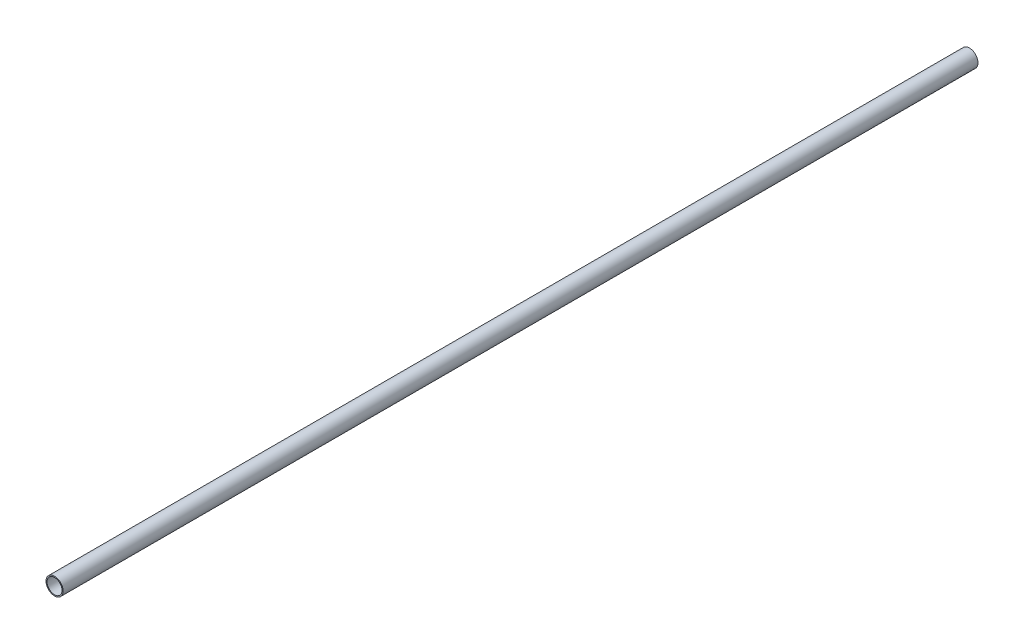
ISO-10303-21;
HEADER;
FILE_DESCRIPTION(('STEP AP214'),'2;1');
FILE_NAME('part.step','',(''),(''),'','','');
FILE_SCHEMA(('AUTOMOTIVE_DESIGN { 1 0 10303 214 1 1 1 1 }'));
ENDSEC;
DATA;
#1=APPLICATION_CONTEXT('core data for automotive mechanical design processes');
#2=APPLICATION_PROTOCOL_DEFINITION('international standard','automotive_design',2000,#1);
#3=PRODUCT_CONTEXT('',#1,'mechanical');
#4=PRODUCT('Part','Part','',(#3));
#5=PRODUCT_RELATED_PRODUCT_CATEGORY('part','',(#4));
#6=PRODUCT_DEFINITION_FORMATION('','',#4);
#7=PRODUCT_DEFINITION_CONTEXT('part definition',#1,'design');
#8=PRODUCT_DEFINITION('design','',#6,#7);
#9=PRODUCT_DEFINITION_SHAPE('','',#8);
#10=(LENGTH_UNIT() NAMED_UNIT(*) SI_UNIT(.MILLI.,.METRE.));
#11=(NAMED_UNIT(*) PLANE_ANGLE_UNIT() SI_UNIT($,.RADIAN.));
#12=(NAMED_UNIT(*) SI_UNIT($,.STERADIAN.) SOLID_ANGLE_UNIT());
#13=UNCERTAINTY_MEASURE_WITH_UNIT(LENGTH_MEASURE(1.E-05),#10,'distance_accuracy_value','');
#14=(GEOMETRIC_REPRESENTATION_CONTEXT(3) GLOBAL_UNCERTAINTY_ASSIGNED_CONTEXT((#13)) GLOBAL_UNIT_ASSIGNED_CONTEXT((#10,
#11,#12)) REPRESENTATION_CONTEXT('',''));
#15=CARTESIAN_POINT('',(0.,0.,0.));
#16=DIRECTION('',(0.,0.,1.));
#17=DIRECTION('',(1.,0.,0.));
#18=AXIS2_PLACEMENT_3D('',#15,#16,#17);
#19=CARTESIAN_POINT('',(0.,0.,213.5));
#20=DIRECTION('',(0.,0.,1.));
#21=DIRECTION('',(1.,0.,0.));
#22=AXIS2_PLACEMENT_3D('',#19,#20,#21);
#23=PLANE('',#22);
#24=CARTESIAN_POINT('',(0.,0.,213.5));
#25=DIRECTION('',(0.,0.,1.));
#26=DIRECTION('',(1.,0.,0.));
#27=AXIS2_PLACEMENT_3D('',#24,#25,#26);
#28=CIRCLE('',#27,4.);
#29=CARTESIAN_POINT('',(4.,0.,213.5));
#30=VERTEX_POINT('',#29);
#31=EDGE_CURVE('E10',#30,#30,#28,.T.);
#32=ORIENTED_EDGE('',*,*,#31,.T.);
#33=EDGE_LOOP('',(#32));
#34=FACE_BOUND('',#33,.T.);
#35=CARTESIAN_POINT('',(0.,0.,213.5));
#36=DIRECTION('',(0.,0.,1.));
#37=DIRECTION('',(1.,0.,0.));
#38=AXIS2_PLACEMENT_3D('',#35,#36,#37);
#39=CIRCLE('',#38,3.5);
#40=CARTESIAN_POINT('',(3.5,0.,213.5));
#41=VERTEX_POINT('',#40);
#42=EDGE_CURVE('E41',#41,#41,#39,.T.);
#43=ORIENTED_EDGE('',*,*,#42,.F.);
#44=EDGE_LOOP('',(#43));
#45=FACE_BOUND('',#44,.T.);
#46=ADVANCED_FACE('F30',(#34,#45),#23,.T.);
#47=CARTESIAN_POINT('',(0.,0.,-213.5));
#48=DIRECTION('',(0.,0.,1.));
#49=DIRECTION('',(1.,0.,0.));
#50=AXIS2_PLACEMENT_3D('',#47,#48,#49);
#51=PLANE('',#50);
#52=CARTESIAN_POINT('',(0.,0.,-213.5));
#53=DIRECTION('',(0.,0.,1.));
#54=DIRECTION('',(1.,0.,0.));
#55=AXIS2_PLACEMENT_3D('',#52,#53,#54);
#56=CIRCLE('',#55,4.);
#57=CARTESIAN_POINT('',(4.,0.,-213.5));
#58=VERTEX_POINT('',#57);
#59=EDGE_CURVE('E34',#58,#58,#56,.T.);
#60=ORIENTED_EDGE('',*,*,#59,.F.);
#61=EDGE_LOOP('',(#60));
#62=FACE_BOUND('',#61,.T.);
#63=CARTESIAN_POINT('',(0.,0.,-213.5));
#64=DIRECTION('',(0.,0.,1.));
#65=DIRECTION('',(1.,0.,0.));
#66=AXIS2_PLACEMENT_3D('',#63,#64,#65);
#67=CIRCLE('',#66,3.5);
#68=CARTESIAN_POINT('',(3.5,0.,-213.5));
#69=VERTEX_POINT('',#68);
#70=EDGE_CURVE('E43',#69,#69,#67,.T.);
#71=ORIENTED_EDGE('',*,*,#70,.T.);
#72=EDGE_LOOP('',(#71));
#73=FACE_BOUND('',#72,.T.);
#74=ADVANCED_FACE('F53',(#62,#73),#51,.F.);
#75=CARTESIAN_POINT('',(0.,0.,213.5));
#76=DIRECTION('',(0.,0.,-1.));
#77=DIRECTION('',(-1.,0.,0.));
#78=AXIS2_PLACEMENT_3D('',#75,#76,#77);
#79=CYLINDRICAL_SURFACE('',#78,4.);
#80=ORIENTED_EDGE('',*,*,#31,.F.);
#81=EDGE_LOOP('',(#80));
#82=FACE_BOUND('',#81,.T.);
#83=ORIENTED_EDGE('',*,*,#59,.T.);
#84=EDGE_LOOP('',(#83));
#85=FACE_BOUND('',#84,.T.);
#86=ADVANCED_FACE('F32',(#82,#85),#79,.T.);
#87=CARTESIAN_POINT('',(0.,0.,213.5));
#88=DIRECTION('',(0.,0.,-1.));
#89=DIRECTION('',(-1.,0.,0.));
#90=AXIS2_PLACEMENT_3D('',#87,#88,#89);
#91=CYLINDRICAL_SURFACE('',#90,3.5);
#92=ORIENTED_EDGE('',*,*,#42,.T.);
#93=EDGE_LOOP('',(#92));
#94=FACE_BOUND('',#93,.T.);
#95=ORIENTED_EDGE('',*,*,#70,.F.);
#96=EDGE_LOOP('',(#95));
#97=FACE_BOUND('',#96,.T.);
#98=ADVANCED_FACE('F49',(#94,#97),#91,.F.);
#99=CLOSED_SHELL('',(#46,#74,#86,#98));
#100=MANIFOLD_SOLID_BREP('B2',#99);
#101=ADVANCED_BREP_SHAPE_REPRESENTATION('',(#18,#100),#14);
#102=SHAPE_DEFINITION_REPRESENTATION(#9,#101);
ENDSEC;
END-ISO-10303-21;
